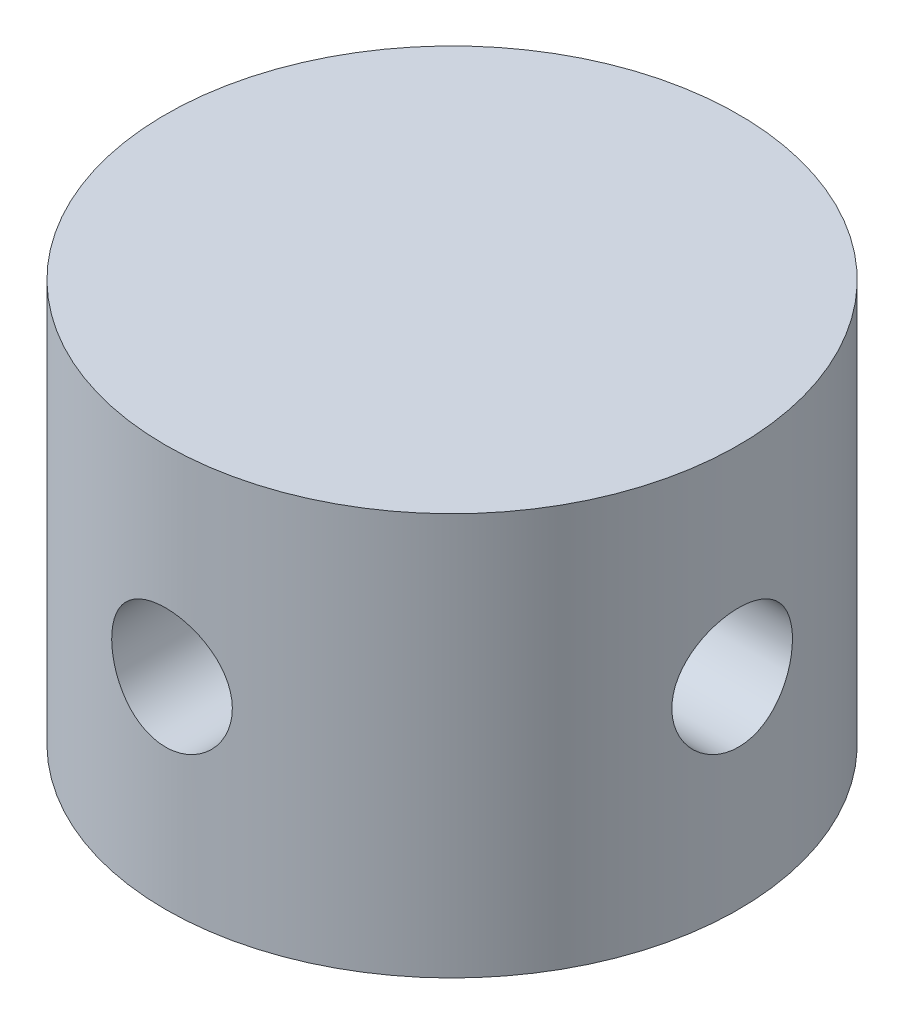
ISO-10303-21;
HEADER;
FILE_DESCRIPTION(('STEP AP214'),'2;1');
FILE_NAME('part.step','',(''),(''),'','','');
FILE_SCHEMA(('AUTOMOTIVE_DESIGN { 1 0 10303 214 1 1 1 1 }'));
ENDSEC;
DATA;
#1=APPLICATION_CONTEXT('core data for automotive mechanical design processes');
#2=APPLICATION_PROTOCOL_DEFINITION('international standard','automotive_design',2000,#1);
#3=PRODUCT_CONTEXT('',#1,'mechanical');
#4=PRODUCT('Part','Part','',(#3));
#5=PRODUCT_RELATED_PRODUCT_CATEGORY('part','',(#4));
#6=PRODUCT_DEFINITION_FORMATION('','',#4);
#7=PRODUCT_DEFINITION_CONTEXT('part definition',#1,'design');
#8=PRODUCT_DEFINITION('design','',#6,#7);
#9=PRODUCT_DEFINITION_SHAPE('','',#8);
#10=(LENGTH_UNIT() NAMED_UNIT(*) SI_UNIT(.MILLI.,.METRE.));
#11=(NAMED_UNIT(*) PLANE_ANGLE_UNIT() SI_UNIT($,.RADIAN.));
#12=(NAMED_UNIT(*) SI_UNIT($,.STERADIAN.) SOLID_ANGLE_UNIT());
#13=UNCERTAINTY_MEASURE_WITH_UNIT(LENGTH_MEASURE(1.E-05),#10,'distance_accuracy_value','');
#14=(GEOMETRIC_REPRESENTATION_CONTEXT(3) GLOBAL_UNCERTAINTY_ASSIGNED_CONTEXT((#13)) GLOBAL_UNIT_ASSIGNED_CONTEXT((#10,
#11,#12)) REPRESENTATION_CONTEXT('',''));
#15=CARTESIAN_POINT('',(0.,0.,0.));
#16=DIRECTION('',(0.,0.,1.));
#17=DIRECTION('',(1.,0.,0.));
#18=AXIS2_PLACEMENT_3D('',#15,#16,#17);
#19=CARTESIAN_POINT('',(0.,20.,0.));
#20=DIRECTION('',(0.,-1.,0.));
#21=DIRECTION('',(0.,0.,-1.));
#22=AXIS2_PLACEMENT_3D('',#19,#20,#21);
#23=CYLINDRICAL_SURFACE('',#22,14.25);
#24=CARTESIAN_POINT('',(2.99999999999995,9.99536264570849,13.930631715755));
#25=CARTESIAN_POINT('',(2.99999407273175,9.82886721325685,13.9306350694233));
#26=CARTESIAN_POINT('',(2.98609252354231,9.66229903793285,13.9336490686333));
#27=CARTESIAN_POINT('',(2.93090795114795,9.33388845406347,13.9453592590967));
#28=CARTESIAN_POINT('',(2.88960418647747,9.17204972231546,13.9540597545363));
#29=CARTESIAN_POINT('',(2.78096413507828,8.85789640026761,13.9761148771583));
#30=CARTESIAN_POINT('',(2.71365521140447,8.70557199389434,13.9894646108851));
#31=CARTESIAN_POINT('',(2.5549923353287,8.41437761354086,14.0193081761239));
#32=CARTESIAN_POINT('',(2.46363925554738,8.27550715153462,14.035801893527));
#33=CARTESIAN_POINT('',(2.25795658766692,8.01298394264261,14.0703635152151));
#34=CARTESIAN_POINT('',(2.14332210398651,7.88957252011813,14.0884502868546));
#35=CARTESIAN_POINT('',(1.894989138135,7.66358110290379,14.1239945260068));
#36=CARTESIAN_POINT('',(1.76128924195888,7.56100265468108,14.1414519467228));
#37=CARTESIAN_POINT('',(1.47701156458826,7.37864251139624,14.1739751058444));
#38=CARTESIAN_POINT('',(1.32628259484498,7.29909168822431,14.1890159922531));
#39=CARTESIAN_POINT('',(1.01322719350418,7.16653686631327,14.21479878611));
#40=CARTESIAN_POINT('',(0.850901968122723,7.11353011110164,14.2255411399167));
#41=CARTESIAN_POINT('',(0.521769054013412,7.03632363482304,14.2413831830226));
#42=CARTESIAN_POINT('',(0.355060987239043,7.01171588215303,14.2465627205912));
#43=CARTESIAN_POINT('',(0.0198076685781616,6.99073140200887,14.2509717954661));
#44=CARTESIAN_POINT('',(-0.148737386079596,6.99435167306758,14.2502019653647));
#45=CARTESIAN_POINT('',(-0.480071518580655,7.02941407603341,14.2428604484778));
#46=CARTESIAN_POINT('',(-0.64290945256746,7.06041653478864,14.2363804530263));
#47=CARTESIAN_POINT('',(-0.961018532741892,7.14866409284132,14.2184506837522));
#48=CARTESIAN_POINT('',(-1.11628935351916,7.20591031960602,14.2070006964132));
#49=CARTESIAN_POINT('',(-1.41609228375941,7.34541752673817,14.1802683626039));
#50=CARTESIAN_POINT('',(-1.56054328432618,7.42784766724933,14.1649602266178));
#51=CARTESIAN_POINT('',(-1.83372413747665,7.61525711819002,14.1321942006921));
#52=CARTESIAN_POINT('',(-1.9624519932725,7.72023928799261,14.1147360382706));
#53=CARTESIAN_POINT('',(-2.20314494546544,7.95217473544458,14.0791960848749));
#54=CARTESIAN_POINT('',(-2.31473871266254,8.07951283365838,14.061108760533));
#55=CARTESIAN_POINT('',(-2.51505310201795,8.35128113442553,14.0266663568076));
#56=CARTESIAN_POINT('',(-2.6037731927549,8.49571173397318,14.0103113176752));
#57=CARTESIAN_POINT('',(-2.75597009651025,8.798135355692,13.981172245478));
#58=CARTESIAN_POINT('',(-2.81938126333311,8.95616237160905,13.9683975242318));
#59=CARTESIAN_POINT('',(-2.91863920179117,9.28096058614142,13.9479976801258));
#60=CARTESIAN_POINT('',(-2.95448999266844,9.44773050595273,13.9403718064083));
#61=CARTESIAN_POINT('',(-2.99704298467477,9.78189986359386,13.9312850369797));
#62=CARTESIAN_POINT('',(-3.00428387028947,9.94922768628578,13.9297102240784));
#63=CARTESIAN_POINT('',(-2.99086596152117,10.2826997911724,13.9325972645622));
#64=CARTESIAN_POINT('',(-2.97020893245225,10.4488441475854,13.9370587359855));
#65=CARTESIAN_POINT('',(-2.90204763754525,10.7733866789875,13.9514084749644));
#66=CARTESIAN_POINT('',(-2.85483608001646,10.9318491867488,13.9612375421685));
#67=CARTESIAN_POINT('',(-2.73522104221627,11.2386149356557,13.9851622510167));
#68=CARTESIAN_POINT('',(-2.66281529884402,11.3869172627169,13.9992582759311));
#69=CARTESIAN_POINT('',(-2.49366584734078,11.6714957192833,14.0303814452717));
#70=CARTESIAN_POINT('',(-2.39658795441132,11.8075688474534,14.0474477309783));
#71=CARTESIAN_POINT('',(-2.18129081640073,12.0616904403484,14.0824834094133));
#72=CARTESIAN_POINT('',(-2.06306914825937,12.1797368363464,14.100452905479));
#73=CARTESIAN_POINT('',(-1.80641133549878,12.3965231853722,14.1356432219504));
#74=CARTESIAN_POINT('',(-1.66766322576955,12.4948972282606,14.1528459123941));
#75=CARTESIAN_POINT('',(-1.37529727784645,12.6669392951701,14.1842391773599));
#76=CARTESIAN_POINT('',(-1.22168010527687,12.740608424466,14.1984298866247));
#77=CARTESIAN_POINT('',(-0.904855274272789,12.8606291801248,14.2221233894864));
#78=CARTESIAN_POINT('',(-0.741712482240459,12.9071461946861,14.231654506413));
#79=CARTESIAN_POINT('',(-0.409706240909357,12.9720623416997,14.2450769586453));
#80=CARTESIAN_POINT('',(-0.240843562060702,12.9904652457576,14.2489690504422));
#81=CARTESIAN_POINT('',(0.0943259629638178,12.9984716994007,14.2506545057702));
#82=CARTESIAN_POINT('',(0.260619374818128,12.9886232435075,14.2485639178517));
#83=CARTESIAN_POINT('',(0.589124475083817,12.9416252097117,14.2387654654102));
#84=CARTESIAN_POINT('',(0.751336226589601,12.9044760540925,14.2310576877731));
#85=CARTESIAN_POINT('',(1.06668635807128,12.8041854090936,14.2108971315503));
#86=CARTESIAN_POINT('',(1.21984867240164,12.7411163501557,14.1984575825559));
#87=CARTESIAN_POINT('',(1.51349270412323,12.5908489583891,14.1701667219788));
#88=CARTESIAN_POINT('',(1.65397328909184,12.5036484735512,14.1543151061404));
#89=CARTESIAN_POINT('',(1.92095580956007,12.3057789718721,14.1205834502782));
#90=CARTESIAN_POINT('',(2.04716599961976,12.1947215453817,14.1026724491366));
#91=CARTESIAN_POINT('',(2.27934648720446,11.9530808084409,14.0670149775653));
#92=CARTESIAN_POINT('',(2.38531194165905,11.8224928390609,14.0492685474691));
#93=CARTESIAN_POINT('',(2.57523141623076,11.5435863366659,14.0157098350715));
#94=CARTESIAN_POINT('',(2.65890154128318,11.3950711737208,13.9999237506872));
#95=CARTESIAN_POINT('',(2.79996396176591,11.0857921642532,13.972398057534));
#96=CARTESIAN_POINT('',(2.85737921903862,10.9250391647374,13.9606549151405));
#97=CARTESIAN_POINT('',(2.93365323653357,10.6359185954381,13.9447939519178));
#98=CARTESIAN_POINT('',(2.95848701414064,10.5091569877167,13.9395173008137));
#99=CARTESIAN_POINT('',(2.99166234709928,10.2533989710498,13.9324349558808));
#100=CARTESIAN_POINT('',(3.00000459384819,10.1244026560216,13.9306291165403));
#101=CARTESIAN_POINT('',(2.99999999999995,9.99536264570849,13.930631715755));
#102=B_SPLINE_CURVE_WITH_KNOTS('',3,(#24,#25,#26,#27,#28,#29,#30,#31,#32,#33,#34,#35,#36,#37,
#38,#39,#40,#41,#42,#43,#44,#45,#46,#47,#48,#49,#50,#51,#52,#53,#54,#55,#56,#57,#58,#59,#60,#61,
#62,#63,#64,#65,#66,#67,#68,#69,#70,#71,#72,#73,#74,#75,#76,#77,#78,#79,#80,#81,#82,#83,#84,#85,
#86,#87,#88,#89,#90,#91,#92,#93,#94,#95,#96,#97,#98,#99,#100,#101),.UNSPECIFIED.,.T.,.F.,(4,2,2,
2,2,2,2,2,2,2,2,2,2,2,2,2,2,2,2,2,2,2,2,2,2,2,2,2,2,2,2,2,2,2,2,2,2,2,4),(0.,0.499013580051086,
0.998405308355625,1.49727299331846,1.99612257566096,2.50198365804439,3.00788227764318,
3.51868998702156,4.02944464049469,4.53276573586809,5.03603331417135,5.53136396516304,
6.02671589821407,6.52547111639667,7.02428960914467,7.53273204167442,8.04118628572137,
8.55095091695638,9.06064119302526,9.56068764222809,10.0607024511563,10.5553107117371,
11.0499634126291,11.5517109349612,12.0535159940564,12.5639288263015,13.0743188201072,
13.5815665933708,14.0887463116029,14.5861551220043,15.0835562387187,15.5795767703218,
16.0756415506538,16.5804948480431,17.0854687687337,17.5965948233673,18.1072730011103,
18.4940428743956,18.8807965322468),.UNSPECIFIED.);
#103=CARTESIAN_POINT('',(2.99999999999995,9.99536264570849,13.930631715755));
#104=VERTEX_POINT('',#103);
#105=EDGE_CURVE('E10',#104,#104,#102,.T.);
#106=ORIENTED_EDGE('',*,*,#105,.T.);
#107=EDGE_LOOP('',(#106));
#108=FACE_BOUND('',#107,.T.);
#109=CARTESIAN_POINT('',(-13.930631715755,9.99536264570849,3.));
#110=CARTESIAN_POINT('',(-13.9306350694233,9.82886721325685,2.9999940727318));
#111=CARTESIAN_POINT('',(-13.9336490686332,9.66229903793285,2.98609252354236));
#112=CARTESIAN_POINT('',(-13.9453592590967,9.33388845406347,2.930907951148));
#113=CARTESIAN_POINT('',(-13.9540597545363,9.17204972231546,2.88960418647752));
#114=CARTESIAN_POINT('',(-13.9761148771583,8.85789640026761,2.78096413507832));
#115=CARTESIAN_POINT('',(-13.9894646108851,8.70557199389434,2.71365521140452));
#116=CARTESIAN_POINT('',(-14.0193081761238,8.41437761354086,2.55499233532875));
#117=CARTESIAN_POINT('',(-14.035801893527,8.27550715153462,2.46363925554743));
#118=CARTESIAN_POINT('',(-14.0703635152151,8.0129839426426,2.25795658766697));
#119=CARTESIAN_POINT('',(-14.0884502868546,7.88957252011812,2.14332210398656));
#120=CARTESIAN_POINT('',(-14.1239945260068,7.66358110290379,1.89498913813505));
#121=CARTESIAN_POINT('',(-14.1414519467228,7.56100265468108,1.76128924195893));
#122=CARTESIAN_POINT('',(-14.1739751058444,7.37864251139624,1.47701156458831));
#123=CARTESIAN_POINT('',(-14.1890159922531,7.29909168822431,1.32628259484503));
#124=CARTESIAN_POINT('',(-14.21479878611,7.16653686631327,1.01322719350423));
#125=CARTESIAN_POINT('',(-14.2255411399167,7.11353011110164,0.850901968122773));
#126=CARTESIAN_POINT('',(-14.2413831830226,7.03632363482304,0.521769054013463));
#127=CARTESIAN_POINT('',(-14.2465627205912,7.01171588215303,0.355060987239093));
#128=CARTESIAN_POINT('',(-14.2509717954661,6.99073140200887,0.0198076685782114));
#129=CARTESIAN_POINT('',(-14.2502019653647,6.99435167306758,-0.148737386079546));
#130=CARTESIAN_POINT('',(-14.2428604484779,7.02941407603341,-0.480071518580604));
#131=CARTESIAN_POINT('',(-14.2363804530263,7.06041653478864,-0.64290945256741));
#132=CARTESIAN_POINT('',(-14.2184506837522,7.14866409284132,-0.961018532741841));
#133=CARTESIAN_POINT('',(-14.2070006964132,7.20591031960602,-1.11628935351911));
#134=CARTESIAN_POINT('',(-14.1802683626039,7.34541752673818,-1.41609228375936));
#135=CARTESIAN_POINT('',(-14.1649602266178,7.42784766724933,-1.56054328432613));
#136=CARTESIAN_POINT('',(-14.1321942006921,7.61525711819002,-1.8337241374766));
#137=CARTESIAN_POINT('',(-14.1147360382706,7.72023928799261,-1.96245199327245));
#138=CARTESIAN_POINT('',(-14.0791960848749,7.95217473544458,-2.20314494546539));
#139=CARTESIAN_POINT('',(-14.0611087605331,8.07951283365838,-2.31473871266249));
#140=CARTESIAN_POINT('',(-14.0266663568076,8.35128113442553,-2.5150531020179));
#141=CARTESIAN_POINT('',(-14.0103113176752,8.49571173397318,-2.60377319275485));
#142=CARTESIAN_POINT('',(-13.981172245478,8.798135355692,-2.7559700965102));
#143=CARTESIAN_POINT('',(-13.9683975242318,8.95616237160905,-2.81938126333306));
#144=CARTESIAN_POINT('',(-13.9479976801258,9.28096058614142,-2.91863920179112));
#145=CARTESIAN_POINT('',(-13.9403718064083,9.44773050595273,-2.95448999266839));
#146=CARTESIAN_POINT('',(-13.9312850369798,9.78189986359385,-2.99704298467472));
#147=CARTESIAN_POINT('',(-13.9297102240784,9.94922768628578,-3.00428387028943));
#148=CARTESIAN_POINT('',(-13.9325972645622,10.2826997911724,-2.99086596152112));
#149=CARTESIAN_POINT('',(-13.9370587359856,10.4488441475854,-2.9702089324522));
#150=CARTESIAN_POINT('',(-13.9514084749644,10.7733866789875,-2.9020476375452));
#151=CARTESIAN_POINT('',(-13.9612375421685,10.9318491867488,-2.85483608001642));
#152=CARTESIAN_POINT('',(-13.9851622510167,11.2386149356557,-2.73522104221623));
#153=CARTESIAN_POINT('',(-13.9992582759311,11.3869172627169,-2.66281529884397));
#154=CARTESIAN_POINT('',(-14.0303814452717,11.6714957192833,-2.49366584734073));
#155=CARTESIAN_POINT('',(-14.0474477309783,11.8075688474534,-2.39658795441127));
#156=CARTESIAN_POINT('',(-14.0824834094133,12.0616904403484,-2.18129081640068));
#157=CARTESIAN_POINT('',(-14.100452905479,12.1797368363464,-2.06306914825932));
#158=CARTESIAN_POINT('',(-14.1356432219504,12.3965231853722,-1.80641133549873));
#159=CARTESIAN_POINT('',(-14.1528459123941,12.4948972282606,-1.6676632257695));
#160=CARTESIAN_POINT('',(-14.1842391773599,12.6669392951701,-1.37529727784641));
#161=CARTESIAN_POINT('',(-14.1984298866247,12.740608424466,-1.22168010527682));
#162=CARTESIAN_POINT('',(-14.2221233894864,12.8606291801248,-0.904855274272742));
#163=CARTESIAN_POINT('',(-14.231654506413,12.9071461946861,-0.741712482240411));
#164=CARTESIAN_POINT('',(-14.2450769586453,12.9720623416997,-0.40970624090931));
#165=CARTESIAN_POINT('',(-14.2489690504422,12.9904652457576,-0.240843562060655));
#166=CARTESIAN_POINT('',(-14.2506545057702,12.9984716994007,0.0943259629638645));
#167=CARTESIAN_POINT('',(-14.2485639178517,12.9886232435075,0.260619374818175));
#168=CARTESIAN_POINT('',(-14.2387654654102,12.9416252097117,0.589124475083863));
#169=CARTESIAN_POINT('',(-14.2310576877731,12.9044760540925,0.751336226589648));
#170=CARTESIAN_POINT('',(-14.2108971315503,12.8041854090936,1.06668635807133));
#171=CARTESIAN_POINT('',(-14.1984575825559,12.7411163501557,1.21984867240169));
#172=CARTESIAN_POINT('',(-14.1701667219788,12.5908489583891,1.51349270412328));
#173=CARTESIAN_POINT('',(-14.1543151061404,12.5036484735512,1.65397328909188));
#174=CARTESIAN_POINT('',(-14.1205834502782,12.3057789718721,1.92095580956011));
#175=CARTESIAN_POINT('',(-14.1026724491366,12.1947215453817,2.04716599961981));
#176=CARTESIAN_POINT('',(-14.0670149775653,11.9530808084409,2.27934648720451));
#177=CARTESIAN_POINT('',(-14.0492685474691,11.822492839061,2.3853119416591));
#178=CARTESIAN_POINT('',(-14.0157098350715,11.5435863366659,2.57523141623081));
#179=CARTESIAN_POINT('',(-13.9999237506872,11.3950711737208,2.65890154128323));
#180=CARTESIAN_POINT('',(-13.972398057534,11.0857921642532,2.79996396176596));
#181=CARTESIAN_POINT('',(-13.9606549151405,10.9250391647374,2.85737921903866));
#182=CARTESIAN_POINT('',(-13.9447939519178,10.6359185954381,2.93365323653361));
#183=CARTESIAN_POINT('',(-13.9395173008137,10.5091569877167,2.95848701414069));
#184=CARTESIAN_POINT('',(-13.9324349558807,10.2533989710498,2.99166234709933));
#185=CARTESIAN_POINT('',(-13.9306291165403,10.1244026560216,3.00000459384824));
#186=CARTESIAN_POINT('',(-13.930631715755,9.99536264570849,3.));
#187=B_SPLINE_CURVE_WITH_KNOTS('',3,(#109,#110,#111,#112,#113,#114,#115,#116,#117,#118,#119,
#120,#121,#122,#123,#124,#125,#126,#127,#128,#129,#130,#131,#132,#133,#134,#135,#136,#137,#138,
#139,#140,#141,#142,#143,#144,#145,#146,#147,#148,#149,#150,#151,#152,#153,#154,#155,#156,#157,
#158,#159,#160,#161,#162,#163,#164,#165,#166,#167,#168,#169,#170,#171,#172,#173,#174,#175,#176,
#177,#178,#179,#180,#181,#182,#183,#184,#185,#186),.UNSPECIFIED.,.T.,.F.,(4,2,2,2,2,2,2,2,2,2,2,
2,2,2,2,2,2,2,2,2,2,2,2,2,2,2,2,2,2,2,2,2,2,2,2,2,2,2,4),(0.,0.499013580051086,
0.998405308355625,1.49727299331846,1.99612257566096,2.50198365804439,3.00788227764318,
3.51868998702156,4.02944464049469,4.53276573586809,5.03603331417135,5.53136396516304,
6.02671589821407,6.52547111639667,7.02428960914467,7.53273204167442,8.04118628572137,
8.55095091695638,9.06064119302526,9.56068764222809,10.0607024511563,10.5553107117371,
11.0499634126291,11.5517109349612,12.0535159940564,12.5639288263015,13.0743188201072,
13.5815665933708,14.0887463116029,14.5861551220043,15.0835562387187,15.5795767703218,
16.0756415506538,16.5804948480431,17.0854687687337,17.5965948233673,18.1072730011103,
18.4940428743956,18.8807965322468),.UNSPECIFIED.);
#188=CARTESIAN_POINT('',(-13.930631715755,9.99536264570849,3.));
#189=VERTEX_POINT('',#188);
#190=EDGE_CURVE('E41',#189,#189,#187,.T.);
#191=ORIENTED_EDGE('',*,*,#190,.T.);
#192=EDGE_LOOP('',(#191));
#193=FACE_BOUND('',#192,.T.);
#194=CARTESIAN_POINT('',(0.,12.9953626457085,-14.25));
#195=CARTESIAN_POINT('',(-0.166541537110377,12.9953567525712,-14.2499969169943));
#196=CARTESIAN_POINT('',(-0.33315572954686,12.9814477645859,-14.2470506101673));
#197=CARTESIAN_POINT('',(-0.66166184651661,12.9262309693713,-14.2355816081481));
#198=CARTESIAN_POINT('',(-0.823550132322042,12.8849026026459,-14.2270547286168));
#199=CARTESIAN_POINT('',(-1.13780843153494,12.7761906327445,-14.2053752165545));
#200=CARTESIAN_POINT('',(-1.2901878408787,12.7088332385806,-14.1922272382771));
#201=CARTESIAN_POINT('',(-1.58147504334519,12.5500560858518,-14.1627291587602));
#202=CARTESIAN_POINT('',(-1.72038338651136,12.4586373103151,-14.1463791883451));
#203=CARTESIAN_POINT('',(-1.98286658497165,12.2528871203411,-14.1119990985041));
#204=CARTESIAN_POINT('',(-2.10621147716541,12.1382655729146,-14.0939494300954));
#205=CARTESIAN_POINT('',(-2.33207370137335,11.8899867678833,-14.0583439878926));
#206=CARTESIAN_POINT('',(-2.43458928269974,11.7563279118117,-14.0407882557203));
#207=CARTESIAN_POINT('',(-2.6168814199727,11.472088924638,-14.0079665337393));
#208=CARTESIAN_POINT('',(-2.6964161614998,11.3213505538418,-13.9927256416313));
#209=CARTESIAN_POINT('',(-2.82893869363958,11.0082748480129,-13.9665385432927));
#210=CARTESIAN_POINT('',(-2.88192940895801,10.8459387931032,-13.9555918639408));
#211=CARTESIAN_POINT('',(-2.95910567697553,10.5167614276128,-13.939431150953));
#212=CARTESIAN_POINT('',(-2.98369675724502,10.3500192347531,-13.9341364952718));
#213=CARTESIAN_POINT('',(-3.00463605189986,10.0146982602911,-13.9296369439432));
#214=CARTESIAN_POINT('',(-3.0009874744215,9.8461196894812,-13.9304313565535));
#215=CARTESIAN_POINT('',(-2.96587805197845,9.51490446038553,-13.9379470751784));
#216=CARTESIAN_POINT('',(-2.93488549448431,9.35221555746983,-13.9445685826961));
#217=CARTESIAN_POINT('',(-2.8467085590333,9.03439932602739,-13.962834919776));
#218=CARTESIAN_POINT('',(-2.78952280910286,8.87927239406019,-13.9744800124668));
#219=CARTESIAN_POINT('',(-2.65014513786664,8.57965231951174,-14.0015814064262));
#220=CARTESIAN_POINT('',(-2.5677706737461,8.43524669827829,-14.0170653676341));
#221=CARTESIAN_POINT('',(-2.3804824308634,8.162133456763,-14.0500825319902));
#222=CARTESIAN_POINT('',(-2.27556579480834,8.03342782975126,-14.0676159947907));
#223=CARTESIAN_POINT('',(-2.04367978902806,7.79266922308593,-14.1031866512734));
#224=CARTESIAN_POINT('',(-1.91631154618264,7.68100051629277,-14.1212269085635));
#225=CARTESIAN_POINT('',(-1.64445525927942,7.48054888713602,-14.1554585365819));
#226=CARTESIAN_POINT('',(-1.49996694780548,7.39176632232367,-14.1716498784223));
#227=CARTESIAN_POINT('',(-1.19752191990414,7.23952300171722,-14.2004059825869));
#228=CARTESIAN_POINT('',(-1.03954062073023,7.17610971390333,-14.2129639345089));
#229=CARTESIAN_POINT('',(-0.714842583633754,7.0768338132177,-14.2329872639561));
#230=CARTESIAN_POINT('',(-0.548127023804757,7.04096749492631,-14.2404533263905));
#231=CARTESIAN_POINT('',(-0.213991768715452,6.99835588611424,-14.2493551082051));
#232=CARTESIAN_POINT('',(-0.0466418821637048,6.99108524996369,-14.2508996021877));
#233=CARTESIAN_POINT('',(0.286881252007628,7.00445155020652,-14.2480878367658));
#234=CARTESIAN_POINT('',(0.45305457261996,7.02508673983282,-14.2437319466962));
#235=CARTESIAN_POINT('',(0.777787427908834,7.09324290181987,-14.2296772315481));
#236=CARTESIAN_POINT('',(0.936406787535,7.14049101039573,-14.2200326577881));
#237=CARTESIAN_POINT('',(1.24347024534653,7.26023105003028,-14.1964790234462));
#238=CARTESIAN_POINT('',(1.39191352075339,7.33272501944679,-14.1825696185314));
#239=CARTESIAN_POINT('',(1.67660282086902,7.50201226492093,-14.1517595902549));
#240=CARTESIAN_POINT('',(1.81265913123362,7.59911760476339,-14.1348214442059));
#241=CARTESIAN_POINT('',(2.06673421406006,7.81445712391255,-14.0999143839684));
#242=CARTESIAN_POINT('',(2.18475082481878,7.93269383172134,-14.081945346602));
#243=CARTESIAN_POINT('',(2.40145142835721,8.18934218234022,-14.0466300400283));
#244=CARTESIAN_POINT('',(2.49977299949451,8.32806239354686,-14.0292995329838));
#245=CARTESIAN_POINT('',(2.67172307298274,8.62035647465625,-13.9975737923331));
#246=CARTESIAN_POINT('',(2.74535261289958,8.77392972008097,-13.983178435401));
#247=CARTESIAN_POINT('',(2.86535107342872,9.09076521641976,-13.9590835341467));
#248=CARTESIAN_POINT('',(2.91186854405698,9.25396916900193,-13.9493584535497));
#249=CARTESIAN_POINT('',(2.97676496342353,9.58610612468187,-13.935655362201));
#250=CARTESIAN_POINT('',(2.99514803454075,9.75503828474838,-13.9316765094909));
#251=CARTESIAN_POINT('',(3.00308852758978,10.0901892362032,-13.929966628784));
#252=CARTESIAN_POINT('',(2.99321966856113,10.2563940612199,-13.932111247594));
#253=CARTESIAN_POINT('',(2.94621169242568,10.5847165006255,-13.9421269515387));
#254=CARTESIAN_POINT('',(2.90907284904228,10.7468341560226,-13.9499979791944));
#255=CARTESIAN_POINT('',(2.80884694961573,11.0619652225413,-13.9705212377295));
#256=CARTESIAN_POINT('',(2.74583751325393,11.215004313508,-13.9831591573303));
#257=CARTESIAN_POINT('',(2.59572800595652,11.5084261953234,-14.0117989214057));
#258=CARTESIAN_POINT('',(2.50862564118453,11.6488077793897,-14.027801086148));
#259=CARTESIAN_POINT('',(2.31087450528696,11.9157708754139,-14.0617418217277));
#260=CARTESIAN_POINT('',(2.19981438635878,12.0420438368392,-14.0797111056862));
#261=CARTESIAN_POINT('',(1.95814113619452,12.2743497120424,-14.1153488491847));
#262=CARTESIAN_POINT('',(1.8275235063962,12.3803779563893,-14.1330172384697));
#263=CARTESIAN_POINT('',(1.54858348059121,12.5703781430897,-14.1663096766607));
#264=CARTESIAN_POINT('',(1.40006997653152,12.6540744209245,-14.1819070783792));
#265=CARTESIAN_POINT('',(1.09079180710252,12.795186172677,-14.2090352755561));
#266=CARTESIAN_POINT('',(0.930037904806179,12.8526244311496,-14.2205695946224));
#267=CARTESIAN_POINT('',(0.640858885658895,12.928952687129,-14.2361315560418));
#268=CARTESIAN_POINT('',(0.514036351019261,12.9538103219283,-14.2413008144957));
#269=CARTESIAN_POINT('',(0.258157040034216,12.9870172683511,-14.2482361660742));
#270=CARTESIAN_POINT('',(0.129100349686608,12.9953672139747,-14.250002389897));
#271=CARTESIAN_POINT('',(0.,12.9953626457085,-14.25));
#272=B_SPLINE_CURVE_WITH_KNOTS('',3,(#194,#195,#196,#197,#198,#199,#200,#201,#202,#203,#204,
#205,#206,#207,#208,#209,#210,#211,#212,#213,#214,#215,#216,#217,#218,#219,#220,#221,#222,#223,
#224,#225,#226,#227,#228,#229,#230,#231,#232,#233,#234,#235,#236,#237,#238,#239,#240,#241,#242,
#243,#244,#245,#246,#247,#248,#249,#250,#251,#252,#253,#254,#255,#256,#257,#258,#259,#260,#261,
#262,#263,#264,#265,#266,#267,#268,#269,#270,#271),.UNSPECIFIED.,.T.,.F.,(4,2,2,2,2,2,2,2,2,2,2,
2,2,2,2,2,2,2,2,2,2,2,2,2,2,2,2,2,2,2,2,2,2,2,2,2,2,2,4),(0.,0.499152175546917,
0.998679047146044,1.49770424288388,1.99670905410248,2.5023887959881,3.00811102230728,
3.5189755362358,4.02978374908918,4.53320408629237,5.03656723380294,5.53147367137181,
6.02640603461657,6.52501377627616,7.02368475539703,7.53232315299179,8.04096949658588,
8.55056315696582,9.06008825847124,9.5602076424524,10.0602957228753,10.5553473403696,
11.0504389377396,11.552153028445,12.0539271926631,12.5642242165084,13.0744997948458,
13.5819525758305,14.089330995427,14.5864794863132,15.0836229871223,15.5792856803964,
16.0749955809124,16.5800116441856,17.0851440487547,17.5962501118787,18.1069118333465,
18.4938615193156,18.8807963436725),.UNSPECIFIED.);
#273=CARTESIAN_POINT('',(0.,12.9953626457085,-14.25));
#274=VERTEX_POINT('',#273);
#275=EDGE_CURVE('E45',#274,#274,#272,.T.);
#276=ORIENTED_EDGE('',*,*,#275,.T.);
#277=EDGE_LOOP('',(#276));
#278=FACE_BOUND('',#277,.T.);
#279=CARTESIAN_POINT('',(13.930631715755,9.99536264570849,-3.));
#280=CARTESIAN_POINT('',(13.9306350694233,9.82886721325685,-2.9999940727318));
#281=CARTESIAN_POINT('',(13.9336490686332,9.66229903793285,-2.98609252354236));
#282=CARTESIAN_POINT('',(13.9453592590967,9.33388845406347,-2.930907951148));
#283=CARTESIAN_POINT('',(13.9540597545363,9.17204972231546,-2.88960418647752));
#284=CARTESIAN_POINT('',(13.9761148771583,8.85789640026761,-2.78096413507832));
#285=CARTESIAN_POINT('',(13.9894646108851,8.70557199389434,-2.71365521140452));
#286=CARTESIAN_POINT('',(14.0193081761238,8.41437761354086,-2.55499233532875));
#287=CARTESIAN_POINT('',(14.035801893527,8.27550715153462,-2.46363925554743));
#288=CARTESIAN_POINT('',(14.0703635152151,8.0129839426426,-2.25795658766697));
#289=CARTESIAN_POINT('',(14.0884502868546,7.88957252011812,-2.14332210398656));
#290=CARTESIAN_POINT('',(14.1239945260068,7.66358110290379,-1.89498913813505));
#291=CARTESIAN_POINT('',(14.1414519467228,7.56100265468108,-1.76128924195893));
#292=CARTESIAN_POINT('',(14.1739751058444,7.37864251139624,-1.47701156458831));
#293=CARTESIAN_POINT('',(14.1890159922531,7.29909168822431,-1.32628259484503));
#294=CARTESIAN_POINT('',(14.21479878611,7.16653686631327,-1.01322719350423));
#295=CARTESIAN_POINT('',(14.2255411399167,7.11353011110164,-0.850901968122773));
#296=CARTESIAN_POINT('',(14.2413831830226,7.03632363482304,-0.521769054013463));
#297=CARTESIAN_POINT('',(14.2465627205912,7.01171588215303,-0.355060987239093));
#298=CARTESIAN_POINT('',(14.2509717954661,6.99073140200887,-0.0198076685782114));
#299=CARTESIAN_POINT('',(14.2502019653647,6.99435167306758,0.148737386079546));
#300=CARTESIAN_POINT('',(14.2428604484779,7.02941407603341,0.480071518580604));
#301=CARTESIAN_POINT('',(14.2363804530263,7.06041653478864,0.64290945256741));
#302=CARTESIAN_POINT('',(14.2184506837522,7.14866409284132,0.961018532741841));
#303=CARTESIAN_POINT('',(14.2070006964132,7.20591031960602,1.11628935351911));
#304=CARTESIAN_POINT('',(14.1802683626039,7.34541752673818,1.41609228375936));
#305=CARTESIAN_POINT('',(14.1649602266178,7.42784766724933,1.56054328432613));
#306=CARTESIAN_POINT('',(14.1321942006921,7.61525711819002,1.8337241374766));
#307=CARTESIAN_POINT('',(14.1147360382706,7.72023928799261,1.96245199327245));
#308=CARTESIAN_POINT('',(14.0791960848749,7.95217473544458,2.20314494546539));
#309=CARTESIAN_POINT('',(14.0611087605331,8.07951283365838,2.31473871266249));
#310=CARTESIAN_POINT('',(14.0266663568076,8.35128113442553,2.5150531020179));
#311=CARTESIAN_POINT('',(14.0103113176752,8.49571173397318,2.60377319275485));
#312=CARTESIAN_POINT('',(13.981172245478,8.798135355692,2.7559700965102));
#313=CARTESIAN_POINT('',(13.9683975242318,8.95616237160905,2.81938126333306));
#314=CARTESIAN_POINT('',(13.9479976801258,9.28096058614142,2.91863920179112));
#315=CARTESIAN_POINT('',(13.9403718064083,9.44773050595273,2.95448999266839));
#316=CARTESIAN_POINT('',(13.9312850369798,9.78189986359385,2.99704298467472));
#317=CARTESIAN_POINT('',(13.9297102240784,9.94922768628578,3.00428387028943));
#318=CARTESIAN_POINT('',(13.9325972645622,10.2826997911724,2.99086596152112));
#319=CARTESIAN_POINT('',(13.9370587359856,10.4488441475854,2.9702089324522));
#320=CARTESIAN_POINT('',(13.9514084749644,10.7733866789875,2.9020476375452));
#321=CARTESIAN_POINT('',(13.9612375421685,10.9318491867488,2.85483608001642));
#322=CARTESIAN_POINT('',(13.9851622510167,11.2386149356557,2.73522104221623));
#323=CARTESIAN_POINT('',(13.9992582759311,11.3869172627169,2.66281529884397));
#324=CARTESIAN_POINT('',(14.0303814452717,11.6714957192833,2.49366584734073));
#325=CARTESIAN_POINT('',(14.0474477309783,11.8075688474534,2.39658795441127));
#326=CARTESIAN_POINT('',(14.0824834094133,12.0616904403484,2.18129081640068));
#327=CARTESIAN_POINT('',(14.100452905479,12.1797368363464,2.06306914825932));
#328=CARTESIAN_POINT('',(14.1356432219504,12.3965231853722,1.80641133549873));
#329=CARTESIAN_POINT('',(14.1528459123941,12.4948972282606,1.6676632257695));
#330=CARTESIAN_POINT('',(14.1842391773599,12.6669392951701,1.37529727784641));
#331=CARTESIAN_POINT('',(14.1984298866247,12.740608424466,1.22168010527682));
#332=CARTESIAN_POINT('',(14.2221233894864,12.8606291801248,0.904855274272742));
#333=CARTESIAN_POINT('',(14.231654506413,12.9071461946861,0.741712482240411));
#334=CARTESIAN_POINT('',(14.2450769586453,12.9720623416997,0.40970624090931));
#335=CARTESIAN_POINT('',(14.2489690504422,12.9904652457576,0.240843562060655));
#336=CARTESIAN_POINT('',(14.2506545057702,12.9984716994007,-0.0943259629638645));
#337=CARTESIAN_POINT('',(14.2485639178517,12.9886232435075,-0.260619374818175));
#338=CARTESIAN_POINT('',(14.2387654654102,12.9416252097117,-0.589124475083863));
#339=CARTESIAN_POINT('',(14.2310576877731,12.9044760540925,-0.751336226589648));
#340=CARTESIAN_POINT('',(14.2108971315503,12.8041854090936,-1.06668635807133));
#341=CARTESIAN_POINT('',(14.1984575825559,12.7411163501557,-1.21984867240169));
#342=CARTESIAN_POINT('',(14.1701667219788,12.5908489583891,-1.51349270412328));
#343=CARTESIAN_POINT('',(14.1543151061404,12.5036484735512,-1.65397328909188));
#344=CARTESIAN_POINT('',(14.1205834502782,12.3057789718721,-1.92095580956011));
#345=CARTESIAN_POINT('',(14.1026724491366,12.1947215453817,-2.04716599961981));
#346=CARTESIAN_POINT('',(14.0670149775653,11.9530808084409,-2.27934648720451));
#347=CARTESIAN_POINT('',(14.0492685474691,11.822492839061,-2.3853119416591));
#348=CARTESIAN_POINT('',(14.0157098350715,11.5435863366659,-2.57523141623081));
#349=CARTESIAN_POINT('',(13.9999237506872,11.3950711737208,-2.65890154128323));
#350=CARTESIAN_POINT('',(13.972398057534,11.0857921642532,-2.79996396176596));
#351=CARTESIAN_POINT('',(13.9606549151405,10.9250391647374,-2.85737921903866));
#352=CARTESIAN_POINT('',(13.9447939519178,10.6359185954381,-2.93365323653361));
#353=CARTESIAN_POINT('',(13.9395173008137,10.5091569877167,-2.95848701414069));
#354=CARTESIAN_POINT('',(13.9324349558807,10.2533989710498,-2.99166234709933));
#355=CARTESIAN_POINT('',(13.9306291165403,10.1244026560216,-3.00000459384824));
#356=CARTESIAN_POINT('',(13.930631715755,9.99536264570849,-3.));
#357=B_SPLINE_CURVE_WITH_KNOTS('',3,(#279,#280,#281,#282,#283,#284,#285,#286,#287,#288,#289,
#290,#291,#292,#293,#294,#295,#296,#297,#298,#299,#300,#301,#302,#303,#304,#305,#306,#307,#308,
#309,#310,#311,#312,#313,#314,#315,#316,#317,#318,#319,#320,#321,#322,#323,#324,#325,#326,#327,
#328,#329,#330,#331,#332,#333,#334,#335,#336,#337,#338,#339,#340,#341,#342,#343,#344,#345,#346,
#347,#348,#349,#350,#351,#352,#353,#354,#355,#356),.UNSPECIFIED.,.T.,.F.,(4,2,2,2,2,2,2,2,2,2,2,
2,2,2,2,2,2,2,2,2,2,2,2,2,2,2,2,2,2,2,2,2,2,2,2,2,2,2,4),(0.,0.499013580051086,
0.998405308355625,1.49727299331846,1.99612257566096,2.50198365804439,3.00788227764318,
3.51868998702156,4.02944464049469,4.53276573586809,5.03603331417135,5.53136396516304,
6.02671589821407,6.52547111639667,7.02428960914467,7.53273204167442,8.04118628572137,
8.55095091695638,9.06064119302526,9.56068764222809,10.0607024511563,10.5553107117371,
11.0499634126291,11.5517109349612,12.0535159940564,12.5639288263015,13.0743188201072,
13.5815665933708,14.0887463116029,14.5861551220043,15.0835562387187,15.5795767703218,
16.0756415506538,16.5804948480431,17.0854687687337,17.5965948233673,18.1072730011103,
18.4940428743956,18.8807965322468),.UNSPECIFIED.);
#358=CARTESIAN_POINT('',(13.930631715755,9.99536264570849,-3.));
#359=VERTEX_POINT('',#358);
#360=EDGE_CURVE('E49',#359,#359,#357,.T.);
#361=ORIENTED_EDGE('',*,*,#360,.T.);
#362=EDGE_LOOP('',(#361));
#363=FACE_BOUND('',#362,.T.);
#364=CARTESIAN_POINT('',(0.,20.,0.));
#365=DIRECTION('',(0.,1.,0.));
#366=DIRECTION('',(0.,0.,1.));
#367=AXIS2_PLACEMENT_3D('',#364,#365,#366);
#368=CIRCLE('',#367,14.25);
#369=CARTESIAN_POINT('',(0.,20.,14.25));
#370=VERTEX_POINT('',#369);
#371=EDGE_CURVE('E88',#370,#370,#368,.T.);
#372=ORIENTED_EDGE('',*,*,#371,.F.);
#373=EDGE_LOOP('',(#372));
#374=FACE_BOUND('',#373,.T.);
#375=CARTESIAN_POINT('',(0.,0.,0.));
#376=DIRECTION('',(0.,1.,0.));
#377=DIRECTION('',(0.,0.,1.));
#378=AXIS2_PLACEMENT_3D('',#375,#376,#377);
#379=CIRCLE('',#378,14.25);
#380=CARTESIAN_POINT('',(0.,0.,14.25));
#381=VERTEX_POINT('',#380);
#382=EDGE_CURVE('E89',#381,#381,#379,.T.);
#383=ORIENTED_EDGE('',*,*,#382,.T.);
#384=EDGE_LOOP('',(#383));
#385=FACE_BOUND('',#384,.T.);
#386=ADVANCED_FACE('F31',(#108,#193,#278,#363,#374,#385),#23,.T.);
#387=CARTESIAN_POINT('',(0.,20.,0.));
#388=DIRECTION('',(0.,1.,0.));
#389=DIRECTION('',(0.,0.,1.));
#390=AXIS2_PLACEMENT_3D('',#387,#388,#389);
#391=PLANE('',#390);
#392=ORIENTED_EDGE('',*,*,#371,.T.);
#393=EDGE_LOOP('',(#392));
#394=FACE_BOUND('',#393,.T.);
#395=ADVANCED_FACE('F83',(#394),#391,.T.);
#396=CARTESIAN_POINT('',(0.,0.,0.));
#397=DIRECTION('',(0.,1.,0.));
#398=DIRECTION('',(0.,0.,1.));
#399=AXIS2_PLACEMENT_3D('',#396,#397,#398);
#400=PLANE('',#399);
#401=ORIENTED_EDGE('',*,*,#382,.F.);
#402=EDGE_LOOP('',(#401));
#403=FACE_BOUND('',#402,.T.);
#404=ADVANCED_FACE('F81',(#403),#400,.F.);
#405=CARTESIAN_POINT('',(5.25,9.99536264570849,0.));
#406=DIRECTION('',(1.,0.,0.));
#407=DIRECTION('',(0.,0.,-1.));
#408=AXIS2_PLACEMENT_3D('',#405,#406,#407);
#409=CYLINDRICAL_SURFACE('',#408,3.);
#410=CARTESIAN_POINT('',(5.25,9.99536264570849,0.));
#411=DIRECTION('',(1.,0.,0.));
#412=DIRECTION('',(0.,0.,-1.));
#413=AXIS2_PLACEMENT_3D('',#410,#411,#412);
#414=CIRCLE('',#413,3.);
#415=CARTESIAN_POINT('',(5.25,9.99536264570849,-3.));
#416=VERTEX_POINT('',#415);
#417=EDGE_CURVE('E92',#416,#416,#414,.T.);
#418=ORIENTED_EDGE('',*,*,#417,.F.);
#419=EDGE_LOOP('',(#418));
#420=FACE_BOUND('',#419,.T.);
#421=ORIENTED_EDGE('',*,*,#360,.F.);
#422=EDGE_LOOP('',(#421));
#423=FACE_BOUND('',#422,.T.);
#424=ADVANCED_FACE('F76',(#420,#423),#409,.F.);
#425=CARTESIAN_POINT('',(5.25,9.99536264570849,0.));
#426=DIRECTION('',(1.,0.,0.));
#427=DIRECTION('',(0.,0.,-1.));
#428=AXIS2_PLACEMENT_3D('',#425,#426,#427);
#429=PLANE('',#428);
#430=ORIENTED_EDGE('',*,*,#417,.T.);
#431=EDGE_LOOP('',(#430));
#432=FACE_BOUND('',#431,.T.);
#433=ADVANCED_FACE('F72',(#432),#429,.T.);
#434=CARTESIAN_POINT('',(0.,9.99536264570849,-5.25));
#435=DIRECTION('',(0.,0.,-1.));
#436=DIRECTION('',(-1.,0.,0.));
#437=AXIS2_PLACEMENT_3D('',#434,#435,#436);
#438=CYLINDRICAL_SURFACE('',#437,3.);
#439=CARTESIAN_POINT('',(0.,9.99536264570849,-5.25));
#440=DIRECTION('',(0.,0.,-1.));
#441=DIRECTION('',(-1.,0.,0.));
#442=AXIS2_PLACEMENT_3D('',#439,#440,#441);
#443=CIRCLE('',#442,3.);
#444=CARTESIAN_POINT('',(-2.99999999999995,9.99536264570849,-5.25000000000003));
#445=VERTEX_POINT('',#444);
#446=EDGE_CURVE('E98',#445,#445,#443,.T.);
#447=ORIENTED_EDGE('',*,*,#446,.F.);
#448=EDGE_LOOP('',(#447));
#449=FACE_BOUND('',#448,.T.);
#450=ORIENTED_EDGE('',*,*,#275,.F.);
#451=EDGE_LOOP('',(#450));
#452=FACE_BOUND('',#451,.T.);
#453=ADVANCED_FACE('F67',(#449,#452),#438,.F.);
#454=CARTESIAN_POINT('',(0.,9.99536264570849,-5.25));
#455=DIRECTION('',(0.,0.,-1.));
#456=DIRECTION('',(-1.,0.,0.));
#457=AXIS2_PLACEMENT_3D('',#454,#455,#456);
#458=PLANE('',#457);
#459=ORIENTED_EDGE('',*,*,#446,.T.);
#460=EDGE_LOOP('',(#459));
#461=FACE_BOUND('',#460,.T.);
#462=ADVANCED_FACE('F64',(#461),#458,.T.);
#463=CARTESIAN_POINT('',(-5.25,9.99536264570849,0.));
#464=DIRECTION('',(-1.,0.,0.));
#465=DIRECTION('',(0.,0.,1.));
#466=AXIS2_PLACEMENT_3D('',#463,#464,#465);
#467=CYLINDRICAL_SURFACE('',#466,3.);
#468=CARTESIAN_POINT('',(-5.25,9.99536264570849,0.));
#469=DIRECTION('',(-1.,0.,0.));
#470=DIRECTION('',(0.,0.,1.));
#471=AXIS2_PLACEMENT_3D('',#468,#469,#470);
#472=CIRCLE('',#471,3.);
#473=CARTESIAN_POINT('',(-5.25,9.99536264570849,3.));
#474=VERTEX_POINT('',#473);
#475=EDGE_CURVE('E101',#474,#474,#472,.T.);
#476=ORIENTED_EDGE('',*,*,#475,.F.);
#477=EDGE_LOOP('',(#476));
#478=FACE_BOUND('',#477,.T.);
#479=ORIENTED_EDGE('',*,*,#190,.F.);
#480=EDGE_LOOP('',(#479));
#481=FACE_BOUND('',#480,.T.);
#482=ADVANCED_FACE('F58',(#478,#481),#467,.F.);
#483=CARTESIAN_POINT('',(-5.25,9.99536264570849,0.));
#484=DIRECTION('',(-1.,0.,0.));
#485=DIRECTION('',(0.,0.,1.));
#486=AXIS2_PLACEMENT_3D('',#483,#484,#485);
#487=PLANE('',#486);
#488=ORIENTED_EDGE('',*,*,#475,.T.);
#489=EDGE_LOOP('',(#488));
#490=FACE_BOUND('',#489,.T.);
#491=ADVANCED_FACE('F63',(#490),#487,.T.);
#492=CARTESIAN_POINT('',(0.,9.99536264570849,5.25));
#493=DIRECTION('',(0.,0.,1.));
#494=DIRECTION('',(1.,0.,0.));
#495=AXIS2_PLACEMENT_3D('',#492,#493,#494);
#496=CYLINDRICAL_SURFACE('',#495,3.);
#497=CARTESIAN_POINT('',(0.,9.99536264570849,5.25));
#498=DIRECTION('',(0.,0.,1.));
#499=DIRECTION('',(1.,0.,0.));
#500=AXIS2_PLACEMENT_3D('',#497,#498,#499);
#501=CIRCLE('',#500,3.);
#502=CARTESIAN_POINT('',(2.99999999999998,9.99536264570849,5.25000000000001));
#503=VERTEX_POINT('',#502);
#504=EDGE_CURVE('E97',#503,#503,#501,.T.);
#505=ORIENTED_EDGE('',*,*,#504,.F.);
#506=EDGE_LOOP('',(#505));
#507=FACE_BOUND('',#506,.T.);
#508=ORIENTED_EDGE('',*,*,#105,.F.);
#509=EDGE_LOOP('',(#508));
#510=FACE_BOUND('',#509,.T.);
#511=ADVANCED_FACE('F109',(#507,#510),#496,.F.);
#512=CARTESIAN_POINT('',(0.,9.99536264570849,5.25));
#513=DIRECTION('',(0.,0.,1.));
#514=DIRECTION('',(1.,0.,0.));
#515=AXIS2_PLACEMENT_3D('',#512,#513,#514);
#516=PLANE('',#515);
#517=ORIENTED_EDGE('',*,*,#504,.T.);
#518=EDGE_LOOP('',(#517));
#519=FACE_BOUND('',#518,.T.);
#520=ADVANCED_FACE('F107',(#519),#516,.T.);
#521=CLOSED_SHELL('',(#386,#395,#404,#424,#433,#453,#462,#482,#491,#511,#520));
#522=MANIFOLD_SOLID_BREP('B2',#521);
#523=ADVANCED_BREP_SHAPE_REPRESENTATION('',(#18,#522),#14);
#524=SHAPE_DEFINITION_REPRESENTATION(#9,#523);
ENDSEC;
END-ISO-10303-21;
